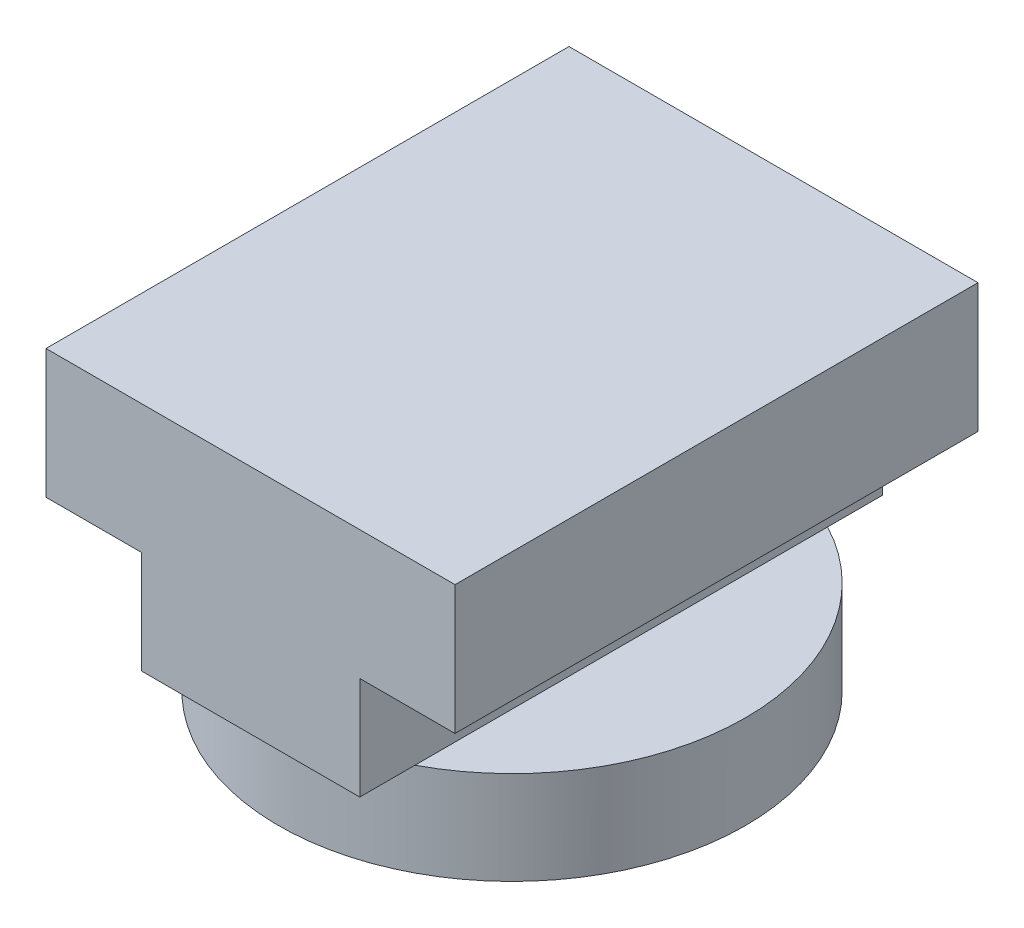
ISO-10303-21;
HEADER;
FILE_DESCRIPTION(('STEP AP214'),'2;1');
FILE_NAME('part.step','',(''),(''),'','','');
FILE_SCHEMA(('AUTOMOTIVE_DESIGN { 1 0 10303 214 1 1 1 1 }'));
ENDSEC;
DATA;
#1=APPLICATION_CONTEXT('core data for automotive mechanical design processes');
#2=APPLICATION_PROTOCOL_DEFINITION('international standard','automotive_design',2000,#1);
#3=PRODUCT_CONTEXT('',#1,'mechanical');
#4=PRODUCT('Part','Part','',(#3));
#5=PRODUCT_RELATED_PRODUCT_CATEGORY('part','',(#4));
#6=PRODUCT_DEFINITION_FORMATION('','',#4);
#7=PRODUCT_DEFINITION_CONTEXT('part definition',#1,'design');
#8=PRODUCT_DEFINITION('design','',#6,#7);
#9=PRODUCT_DEFINITION_SHAPE('','',#8);
#10=(LENGTH_UNIT() NAMED_UNIT(*) SI_UNIT(.MILLI.,.METRE.));
#11=(NAMED_UNIT(*) PLANE_ANGLE_UNIT() SI_UNIT($,.RADIAN.));
#12=(NAMED_UNIT(*) SI_UNIT($,.STERADIAN.) SOLID_ANGLE_UNIT());
#13=UNCERTAINTY_MEASURE_WITH_UNIT(LENGTH_MEASURE(1.E-05),#10,'distance_accuracy_value','');
#14=(GEOMETRIC_REPRESENTATION_CONTEXT(3) GLOBAL_UNCERTAINTY_ASSIGNED_CONTEXT((#13)) GLOBAL_UNIT_ASSIGNED_CONTEXT((#10,
#11,#12)) REPRESENTATION_CONTEXT('',''));
#15=CARTESIAN_POINT('',(0.,0.,0.));
#16=DIRECTION('',(0.,0.,1.));
#17=DIRECTION('',(1.,0.,0.));
#18=AXIS2_PLACEMENT_3D('',#15,#16,#17);
#19=CARTESIAN_POINT('',(0.,-5.5,-28.));
#20=DIRECTION('',(0.,-1.,0.));
#21=DIRECTION('',(0.,0.,-1.));
#22=AXIS2_PLACEMENT_3D('',#19,#20,#21);
#23=PLANE('',#22);
#24=CARTESIAN_POINT('',(0.,-5.5,-14.));
#25=DIRECTION('',(0.,-1.,0.));
#26=DIRECTION('',(0.,0.,-1.));
#27=AXIS2_PLACEMENT_3D('',#24,#25,#26);
#28=CIRCLE('',#27,12.5);
#29=CARTESIAN_POINT('',(5.85,-5.5,-2.95339418644804));
#30=VERTEX_POINT('',#29);
#31=CARTESIAN_POINT('',(-5.85,-5.5,-2.95339418644804));
#32=VERTEX_POINT('',#31);
#33=EDGE_CURVE('E11',#30,#32,#28,.T.);
#34=ORIENTED_EDGE('',*,*,#33,.F.);
#35=DIRECTION('',(0.,0.,1.));
#36=VECTOR('',#35,1.);
#37=CARTESIAN_POINT('',(5.85,-5.5,-28.));
#38=LINE('',#37,#36);
#39=CARTESIAN_POINT('',(5.85,-5.5,0.));
#40=VERTEX_POINT('',#39);
#41=EDGE_CURVE('E125',#30,#40,#38,.T.);
#42=ORIENTED_EDGE('',*,*,#41,.T.);
#43=DIRECTION('',(1.,0.,0.));
#44=VECTOR('',#43,1.);
#45=CARTESIAN_POINT('',(0.,-5.5,0.));
#46=LINE('',#45,#44);
#47=CARTESIAN_POINT('',(-5.85,-5.5,0.));
#48=VERTEX_POINT('',#47);
#49=EDGE_CURVE('E145',#48,#40,#46,.T.);
#50=ORIENTED_EDGE('',*,*,#49,.F.);
#51=DIRECTION('',(0.,0.,1.));
#52=VECTOR('',#51,1.);
#53=CARTESIAN_POINT('',(-5.85,-5.5,-28.));
#54=LINE('',#53,#52);
#55=EDGE_CURVE('E58',#32,#48,#54,.T.);
#56=ORIENTED_EDGE('',*,*,#55,.F.);
#57=EDGE_LOOP('',(#34,#42,#50,#56));
#58=FACE_BOUND('',#57,.T.);
#59=ADVANCED_FACE('F37',(#58),#23,.T.);
#60=CARTESIAN_POINT('',(5.85,0.,-28.));
#61=DIRECTION('',(-1.,0.,0.));
#62=DIRECTION('',(0.,0.,1.));
#63=AXIS2_PLACEMENT_3D('',#60,#61,#62);
#64=PLANE('',#63);
#65=DIRECTION('',(0.,-1.,0.));
#66=VECTOR('',#65,1.);
#67=CARTESIAN_POINT('',(5.85,0.,0.));
#68=LINE('',#67,#66);
#69=CARTESIAN_POINT('',(5.85,0.,0.));
#70=VERTEX_POINT('',#69);
#71=EDGE_CURVE('E139',#70,#40,#68,.T.);
#72=ORIENTED_EDGE('',*,*,#71,.T.);
#73=ORIENTED_EDGE('',*,*,#41,.F.);
#74=CARTESIAN_POINT('',(5.85,-5.5,-25.046605813552));
#75=VERTEX_POINT('',#74);
#76=EDGE_CURVE('E123',#75,#30,#38,.T.);
#77=ORIENTED_EDGE('',*,*,#76,.F.);
#78=CARTESIAN_POINT('',(5.85,-5.5,-28.));
#79=VERTEX_POINT('',#78);
#80=EDGE_CURVE('E114',#79,#75,#38,.T.);
#81=ORIENTED_EDGE('',*,*,#80,.F.);
#82=DIRECTION('',(0.,-1.,0.));
#83=VECTOR('',#82,1.);
#84=CARTESIAN_POINT('',(5.85,0.,-28.));
#85=LINE('',#84,#83);
#86=CARTESIAN_POINT('',(5.85,0.,-28.));
#87=VERTEX_POINT('',#86);
#88=EDGE_CURVE('E142',#87,#79,#85,.T.);
#89=ORIENTED_EDGE('',*,*,#88,.F.);
#90=DIRECTION('',(0.,0.,1.));
#91=VECTOR('',#90,1.);
#92=CARTESIAN_POINT('',(5.85,0.,-28.));
#93=LINE('',#92,#91);
#94=EDGE_CURVE('E41',#87,#70,#93,.T.);
#95=ORIENTED_EDGE('',*,*,#94,.T.);
#96=EDGE_LOOP('',(#72,#73,#77,#81,#89,#95));
#97=FACE_BOUND('',#96,.T.);
#98=ADVANCED_FACE('F39',(#97),#64,.F.);
#99=CARTESIAN_POINT('',(-5.85,-5.5,-25.046605813552));
#100=VERTEX_POINT('',#99);
#101=EDGE_CURVE('E46',#100,#75,#28,.T.);
#102=ORIENTED_EDGE('',*,*,#101,.F.);
#103=CARTESIAN_POINT('',(-5.85,-5.5,-28.));
#104=VERTEX_POINT('',#103);
#105=EDGE_CURVE('E181',#104,#100,#54,.T.);
#106=ORIENTED_EDGE('',*,*,#105,.F.);
#107=DIRECTION('',(1.,0.,0.));
#108=VECTOR('',#107,1.);
#109=CARTESIAN_POINT('',(0.,-5.5,-28.));
#110=LINE('',#109,#108);
#111=EDGE_CURVE('E120',#104,#79,#110,.T.);
#112=ORIENTED_EDGE('',*,*,#111,.T.);
#113=ORIENTED_EDGE('',*,*,#80,.T.);
#114=EDGE_LOOP('',(#102,#106,#112,#113));
#115=FACE_BOUND('',#114,.T.);
#116=ADVANCED_FACE('F116',(#115),#23,.T.);
#117=CARTESIAN_POINT('',(-5.85,0.,-28.));
#118=DIRECTION('',(-1.,0.,0.));
#119=DIRECTION('',(0.,0.,1.));
#120=AXIS2_PLACEMENT_3D('',#117,#118,#119);
#121=PLANE('',#120);
#122=DIRECTION('',(0.,-1.,0.));
#123=VECTOR('',#122,1.);
#124=CARTESIAN_POINT('',(-5.85,0.,0.));
#125=LINE('',#124,#123);
#126=CARTESIAN_POINT('',(-5.85,0.,0.));
#127=VERTEX_POINT('',#126);
#128=EDGE_CURVE('E176',#127,#48,#125,.T.);
#129=ORIENTED_EDGE('',*,*,#128,.F.);
#130=DIRECTION('',(0.,0.,1.));
#131=VECTOR('',#130,1.);
#132=CARTESIAN_POINT('',(-5.85,0.,-28.));
#133=LINE('',#132,#131);
#134=CARTESIAN_POINT('',(-5.85,0.,-28.));
#135=VERTEX_POINT('',#134);
#136=EDGE_CURVE('E184',#135,#127,#133,.T.);
#137=ORIENTED_EDGE('',*,*,#136,.F.);
#138=DIRECTION('',(0.,-1.,0.));
#139=VECTOR('',#138,1.);
#140=CARTESIAN_POINT('',(-5.85,0.,-28.));
#141=LINE('',#140,#139);
#142=EDGE_CURVE('E158',#135,#104,#141,.T.);
#143=ORIENTED_EDGE('',*,*,#142,.T.);
#144=ORIENTED_EDGE('',*,*,#105,.T.);
#145=EDGE_CURVE('E183',#100,#32,#54,.T.);
#146=ORIENTED_EDGE('',*,*,#145,.T.);
#147=ORIENTED_EDGE('',*,*,#55,.T.);
#148=EDGE_LOOP('',(#129,#137,#143,#144,#146,#147));
#149=FACE_BOUND('',#148,.T.);
#150=ADVANCED_FACE('F213',(#149),#121,.T.);
#151=CARTESIAN_POINT('',(0.,0.,-28.));
#152=DIRECTION('',(0.,-1.,0.));
#153=DIRECTION('',(1.,0.,0.));
#154=AXIS2_PLACEMENT_3D('',#151,#152,#153);
#155=PLANE('',#154);
#156=DIRECTION('',(1.,0.,0.));
#157=VECTOR('',#156,1.);
#158=CARTESIAN_POINT('',(0.,0.,0.));
#159=LINE('',#158,#157);
#160=CARTESIAN_POINT('',(-10.95,0.,0.));
#161=VERTEX_POINT('',#160);
#162=EDGE_CURVE('E173',#161,#127,#159,.T.);
#163=ORIENTED_EDGE('',*,*,#162,.F.);
#164=DIRECTION('',(0.,0.,1.));
#165=VECTOR('',#164,1.);
#166=CARTESIAN_POINT('',(-10.95,0.,-28.));
#167=LINE('',#166,#165);
#168=CARTESIAN_POINT('',(-10.95,0.,-28.));
#169=VERTEX_POINT('',#168);
#170=EDGE_CURVE('E186',#169,#161,#167,.T.);
#171=ORIENTED_EDGE('',*,*,#170,.F.);
#172=DIRECTION('',(1.,0.,0.));
#173=VECTOR('',#172,1.);
#174=CARTESIAN_POINT('',(0.,0.,-28.));
#175=LINE('',#174,#173);
#176=EDGE_CURVE('E155',#169,#135,#175,.T.);
#177=ORIENTED_EDGE('',*,*,#176,.T.);
#178=ORIENTED_EDGE('',*,*,#136,.T.);
#179=EDGE_LOOP('',(#163,#171,#177,#178));
#180=FACE_BOUND('',#179,.T.);
#181=ADVANCED_FACE('F217',(#180),#155,.T.);
#182=CARTESIAN_POINT('',(-10.95,0.,-28.));
#183=DIRECTION('',(-1.,0.,0.));
#184=DIRECTION('',(0.,0.,1.));
#185=AXIS2_PLACEMENT_3D('',#182,#183,#184);
#186=PLANE('',#185);
#187=DIRECTION('',(0.,-1.,0.));
#188=VECTOR('',#187,1.);
#189=CARTESIAN_POINT('',(-10.95,0.,0.));
#190=LINE('',#189,#188);
#191=CARTESIAN_POINT('',(-10.95,6.9,0.));
#192=VERTEX_POINT('',#191);
#193=EDGE_CURVE('E170',#192,#161,#190,.T.);
#194=ORIENTED_EDGE('',*,*,#193,.F.);
#195=DIRECTION('',(0.,0.,1.));
#196=VECTOR('',#195,1.);
#197=CARTESIAN_POINT('',(-10.95,6.9,-28.));
#198=LINE('',#197,#196);
#199=CARTESIAN_POINT('',(-10.95,6.9,-28.));
#200=VERTEX_POINT('',#199);
#201=EDGE_CURVE('E188',#200,#192,#198,.T.);
#202=ORIENTED_EDGE('',*,*,#201,.F.);
#203=DIRECTION('',(0.,-1.,0.));
#204=VECTOR('',#203,1.);
#205=CARTESIAN_POINT('',(-10.95,0.,-28.));
#206=LINE('',#205,#204);
#207=EDGE_CURVE('E152',#200,#169,#206,.T.);
#208=ORIENTED_EDGE('',*,*,#207,.T.);
#209=ORIENTED_EDGE('',*,*,#170,.T.);
#210=EDGE_LOOP('',(#194,#202,#208,#209));
#211=FACE_BOUND('',#210,.T.);
#212=ADVANCED_FACE('F223',(#211),#186,.T.);
#213=CARTESIAN_POINT('',(0.,6.9,-28.));
#214=DIRECTION('',(0.,1.,0.));
#215=DIRECTION('',(-1.,0.,0.));
#216=AXIS2_PLACEMENT_3D('',#213,#214,#215);
#217=PLANE('',#216);
#218=DIRECTION('',(-1.,0.,0.));
#219=VECTOR('',#218,1.);
#220=CARTESIAN_POINT('',(0.,6.9,0.));
#221=LINE('',#220,#219);
#222=CARTESIAN_POINT('',(10.95,6.9,0.));
#223=VERTEX_POINT('',#222);
#224=EDGE_CURVE('E167',#223,#192,#221,.T.);
#225=ORIENTED_EDGE('',*,*,#224,.F.);
#226=DIRECTION('',(0.,0.,1.));
#227=VECTOR('',#226,1.);
#228=CARTESIAN_POINT('',(10.95,6.9,-28.));
#229=LINE('',#228,#227);
#230=CARTESIAN_POINT('',(10.95,6.9,-28.));
#231=VERTEX_POINT('',#230);
#232=EDGE_CURVE('E190',#231,#223,#229,.T.);
#233=ORIENTED_EDGE('',*,*,#232,.F.);
#234=DIRECTION('',(-1.,0.,0.));
#235=VECTOR('',#234,1.);
#236=CARTESIAN_POINT('',(0.,6.9,-28.));
#237=LINE('',#236,#235);
#238=EDGE_CURVE('E149',#231,#200,#237,.T.);
#239=ORIENTED_EDGE('',*,*,#238,.T.);
#240=ORIENTED_EDGE('',*,*,#201,.T.);
#241=EDGE_LOOP('',(#225,#233,#239,#240));
#242=FACE_BOUND('',#241,.T.);
#243=ADVANCED_FACE('F229',(#242),#217,.T.);
#244=CARTESIAN_POINT('',(10.95,0.,-28.));
#245=DIRECTION('',(-1.,0.,0.));
#246=DIRECTION('',(0.,0.,1.));
#247=AXIS2_PLACEMENT_3D('',#244,#245,#246);
#248=PLANE('',#247);
#249=DIRECTION('',(0.,-1.,0.));
#250=VECTOR('',#249,1.);
#251=CARTESIAN_POINT('',(10.95,0.,0.));
#252=LINE('',#251,#250);
#253=CARTESIAN_POINT('',(10.95,0.,0.));
#254=VERTEX_POINT('',#253);
#255=EDGE_CURVE('E165',#223,#254,#252,.T.);
#256=ORIENTED_EDGE('',*,*,#255,.T.);
#257=DIRECTION('',(0.,0.,1.));
#258=VECTOR('',#257,1.);
#259=CARTESIAN_POINT('',(10.95,0.,-28.));
#260=LINE('',#259,#258);
#261=CARTESIAN_POINT('',(10.95,0.,-28.));
#262=VERTEX_POINT('',#261);
#263=EDGE_CURVE('E191',#262,#254,#260,.T.);
#264=ORIENTED_EDGE('',*,*,#263,.F.);
#265=DIRECTION('',(0.,-1.,0.));
#266=VECTOR('',#265,1.);
#267=CARTESIAN_POINT('',(10.95,0.,-28.));
#268=LINE('',#267,#266);
#269=EDGE_CURVE('E147',#231,#262,#268,.T.);
#270=ORIENTED_EDGE('',*,*,#269,.F.);
#271=ORIENTED_EDGE('',*,*,#232,.T.);
#272=EDGE_LOOP('',(#256,#264,#270,#271));
#273=FACE_BOUND('',#272,.T.);
#274=ADVANCED_FACE('F233',(#273),#248,.F.);
#275=CARTESIAN_POINT('',(0.,0.,-28.));
#276=DIRECTION('',(0.,1.,0.));
#277=DIRECTION('',(-1.,0.,0.));
#278=AXIS2_PLACEMENT_3D('',#275,#276,#277);
#279=PLANE('',#278);
#280=DIRECTION('',(-1.,0.,0.));
#281=VECTOR('',#280,1.);
#282=CARTESIAN_POINT('',(0.,0.,0.));
#283=LINE('',#282,#281);
#284=EDGE_CURVE('E163',#254,#70,#283,.T.);
#285=ORIENTED_EDGE('',*,*,#284,.T.);
#286=ORIENTED_EDGE('',*,*,#94,.F.);
#287=DIRECTION('',(-1.,0.,0.));
#288=VECTOR('',#287,1.);
#289=CARTESIAN_POINT('',(0.,0.,-28.));
#290=LINE('',#289,#288);
#291=EDGE_CURVE('E144',#262,#87,#290,.T.);
#292=ORIENTED_EDGE('',*,*,#291,.F.);
#293=ORIENTED_EDGE('',*,*,#263,.T.);
#294=EDGE_LOOP('',(#285,#286,#292,#293));
#295=FACE_BOUND('',#294,.T.);
#296=ADVANCED_FACE('F236',(#295),#279,.F.);
#297=CARTESIAN_POINT('',(0.,0.,-28.));
#298=DIRECTION('',(0.,0.,1.));
#299=DIRECTION('',(1.,0.,0.));
#300=AXIS2_PLACEMENT_3D('',#297,#298,#299);
#301=PLANE('',#300);
#302=ORIENTED_EDGE('',*,*,#88,.T.);
#303=ORIENTED_EDGE('',*,*,#111,.F.);
#304=ORIENTED_EDGE('',*,*,#142,.F.);
#305=ORIENTED_EDGE('',*,*,#176,.F.);
#306=ORIENTED_EDGE('',*,*,#207,.F.);
#307=ORIENTED_EDGE('',*,*,#238,.F.);
#308=ORIENTED_EDGE('',*,*,#269,.T.);
#309=ORIENTED_EDGE('',*,*,#291,.T.);
#310=EDGE_LOOP('',(#302,#303,#304,#305,#306,#307,#308,#309));
#311=FACE_BOUND('',#310,.T.);
#312=ADVANCED_FACE('F239',(#311),#301,.F.);
#313=CARTESIAN_POINT('',(0.,0.,0.));
#314=DIRECTION('',(0.,0.,1.));
#315=DIRECTION('',(1.,0.,0.));
#316=AXIS2_PLACEMENT_3D('',#313,#314,#315);
#317=PLANE('',#316);
#318=ORIENTED_EDGE('',*,*,#71,.F.);
#319=ORIENTED_EDGE('',*,*,#284,.F.);
#320=ORIENTED_EDGE('',*,*,#255,.F.);
#321=ORIENTED_EDGE('',*,*,#224,.T.);
#322=ORIENTED_EDGE('',*,*,#193,.T.);
#323=ORIENTED_EDGE('',*,*,#162,.T.);
#324=ORIENTED_EDGE('',*,*,#128,.T.);
#325=ORIENTED_EDGE('',*,*,#49,.T.);
#326=EDGE_LOOP('',(#318,#319,#320,#321,#322,#323,#324,#325));
#327=FACE_BOUND('',#326,.T.);
#328=ADVANCED_FACE('F201',(#327),#317,.T.);
#329=CARTESIAN_POINT('',(0.,-5.5,-14.));
#330=DIRECTION('',(0.,-1.,0.));
#331=DIRECTION('',(0.,0.,-1.));
#332=AXIS2_PLACEMENT_3D('',#329,#330,#331);
#333=PLANE('',#332);
#334=EDGE_CURVE('E134',#75,#30,#28,.T.);
#335=ORIENTED_EDGE('',*,*,#334,.F.);
#336=ORIENTED_EDGE('',*,*,#76,.T.);
#337=EDGE_LOOP('',(#335,#336));
#338=FACE_BOUND('',#337,.T.);
#339=ADVANCED_FACE('F136',(#338),#333,.F.);
#340=CARTESIAN_POINT('',(0.,-10.5,-14.));
#341=DIRECTION('',(0.,1.,0.));
#342=DIRECTION('',(0.,0.,1.));
#343=AXIS2_PLACEMENT_3D('',#340,#341,#342);
#344=CYLINDRICAL_SURFACE('',#343,12.5);
#345=CARTESIAN_POINT('',(0.,-10.5,-14.));
#346=DIRECTION('',(0.,-1.,0.));
#347=DIRECTION('',(0.,0.,-1.));
#348=AXIS2_PLACEMENT_3D('',#345,#346,#347);
#349=CIRCLE('',#348,12.5);
#350=CARTESIAN_POINT('',(0.,-10.5,-26.5));
#351=VERTEX_POINT('',#350);
#352=EDGE_CURVE('E137',#351,#351,#349,.T.);
#353=ORIENTED_EDGE('',*,*,#352,.F.);
#354=EDGE_LOOP('',(#353));
#355=FACE_BOUND('',#354,.T.);
#356=ORIENTED_EDGE('',*,*,#334,.T.);
#357=ORIENTED_EDGE('',*,*,#33,.T.);
#358=EDGE_CURVE('E48',#32,#100,#28,.T.);
#359=ORIENTED_EDGE('',*,*,#358,.T.);
#360=ORIENTED_EDGE('',*,*,#101,.T.);
#361=EDGE_LOOP('',(#356,#357,#359,#360));
#362=FACE_BOUND('',#361,.T.);
#363=ADVANCED_FACE('F133',(#355,#362),#344,.T.);
#364=CARTESIAN_POINT('',(0.,-10.5,-14.));
#365=DIRECTION('',(0.,-1.,0.));
#366=DIRECTION('',(0.,0.,-1.));
#367=AXIS2_PLACEMENT_3D('',#364,#365,#366);
#368=PLANE('',#367);
#369=ORIENTED_EDGE('',*,*,#352,.T.);
#370=EDGE_LOOP('',(#369));
#371=FACE_BOUND('',#370,.T.);
#372=ADVANCED_FACE('F251',(#371),#368,.T.);
#373=ORIENTED_EDGE('',*,*,#145,.F.);
#374=ORIENTED_EDGE('',*,*,#358,.F.);
#375=EDGE_LOOP('',(#373,#374));
#376=FACE_BOUND('',#375,.T.);
#377=ADVANCED_FACE('F253',(#376),#333,.F.);
#378=CLOSED_SHELL('',(#59,#98,#116,#150,#181,#212,#243,#274,#296,#312,#328,#339,#363,#372,#377));
#379=MANIFOLD_SOLID_BREP('B2',#378);
#380=ADVANCED_BREP_SHAPE_REPRESENTATION('',(#18,#379),#14);
#381=SHAPE_DEFINITION_REPRESENTATION(#9,#380);
ENDSEC;
END-ISO-10303-21;
